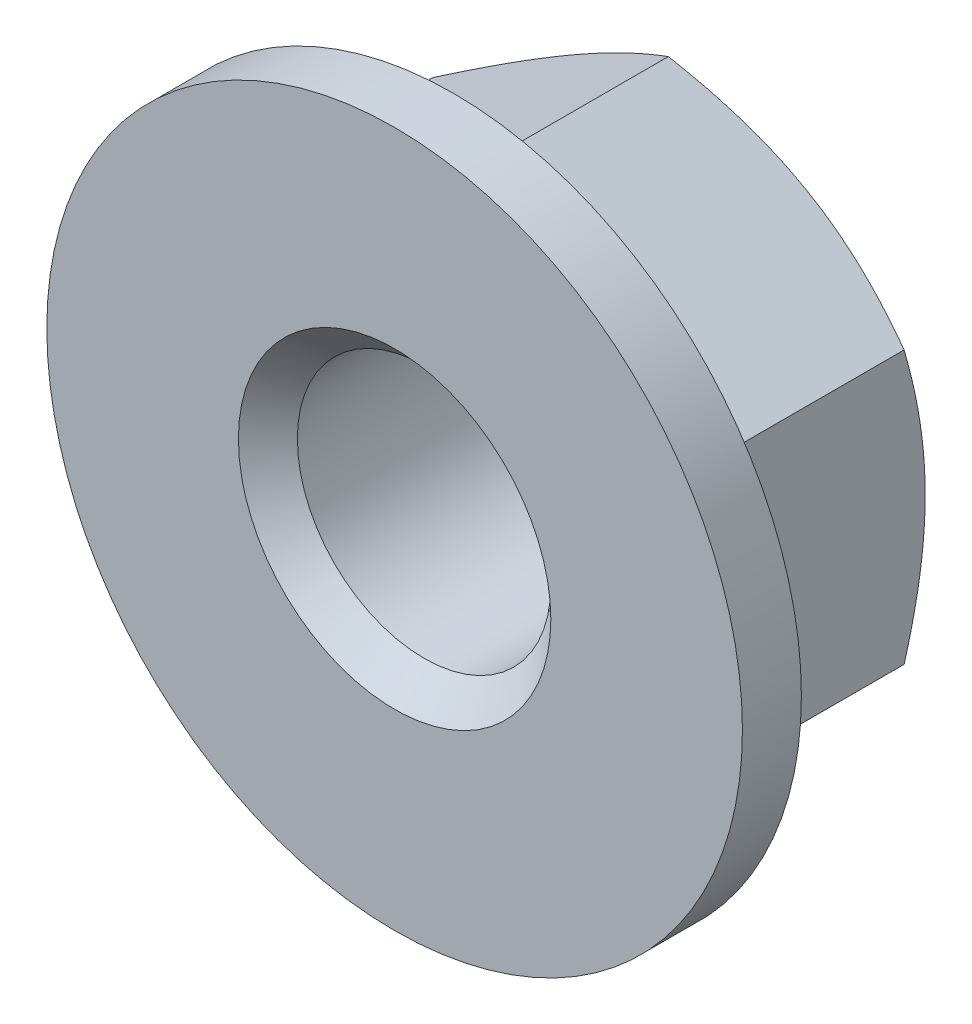
ISO-10303-21;
HEADER;
FILE_DESCRIPTION(('STEP AP214'),'2;1');
FILE_NAME('part.step','',(''),(''),'','','');
FILE_SCHEMA(('AUTOMOTIVE_DESIGN { 1 0 10303 214 1 1 1 1 }'));
ENDSEC;
DATA;
#1=APPLICATION_CONTEXT('core data for automotive mechanical design processes');
#2=APPLICATION_PROTOCOL_DEFINITION('international standard','automotive_design',2000,#1);
#3=PRODUCT_CONTEXT('',#1,'mechanical');
#4=PRODUCT('Part','Part','',(#3));
#5=PRODUCT_RELATED_PRODUCT_CATEGORY('part','',(#4));
#6=PRODUCT_DEFINITION_FORMATION('','',#4);
#7=PRODUCT_DEFINITION_CONTEXT('part definition',#1,'design');
#8=PRODUCT_DEFINITION('design','',#6,#7);
#9=PRODUCT_DEFINITION_SHAPE('','',#8);
#10=(LENGTH_UNIT() NAMED_UNIT(*) SI_UNIT(.MILLI.,.METRE.));
#11=(NAMED_UNIT(*) PLANE_ANGLE_UNIT() SI_UNIT($,.RADIAN.));
#12=(NAMED_UNIT(*) SI_UNIT($,.STERADIAN.) SOLID_ANGLE_UNIT());
#13=UNCERTAINTY_MEASURE_WITH_UNIT(LENGTH_MEASURE(1.E-05),#10,'distance_accuracy_value','');
#14=(GEOMETRIC_REPRESENTATION_CONTEXT(3) GLOBAL_UNCERTAINTY_ASSIGNED_CONTEXT((#13)) GLOBAL_UNIT_ASSIGNED_CONTEXT((#10,
#11,#12)) REPRESENTATION_CONTEXT('',''));
#15=CARTESIAN_POINT('',(0.,0.,0.));
#16=DIRECTION('',(0.,0.,1.));
#17=DIRECTION('',(1.,0.,0.));
#18=AXIS2_PLACEMENT_3D('',#15,#16,#17);
#19=CARTESIAN_POINT('',(4.,2.3094010767585,-4.));
#20=DIRECTION('',(0.5,0.866025403784439,0.));
#21=DIRECTION('',(-0.866025403784439,0.5,0.));
#22=AXIS2_PLACEMENT_3D('',#19,#20,#21);
#23=PLANE('',#22);
#24=DIRECTION('',(0.,0.,1.));
#25=VECTOR('',#24,1.);
#26=CARTESIAN_POINT('',(4.,2.3094010767585,-4.));
#27=LINE('',#26,#25);
#28=CARTESIAN_POINT('',(4.,2.3094010767585,-3.64273441009184));
#29=VERTEX_POINT('',#28);
#30=CARTESIAN_POINT('',(4.,2.3094010767585,-0.357265589908159));
#31=VERTEX_POINT('',#30);
#32=EDGE_CURVE('E366',#29,#31,#27,.T.);
#33=ORIENTED_EDGE('',*,*,#32,.F.);
#34=CARTESIAN_POINT('',(4.0002,2.30928560670467,-3.64266774092524));
#35=CARTESIAN_POINT('',(3.82442084967677,2.4107717464617,-3.70128212635172));
#36=CARTESIAN_POINT('',(3.64712438367362,2.51313390883499,-3.75458967853774));
#37=CARTESIAN_POINT('',(3.28946140682429,2.71963072479811,-3.8476383292536));
#38=CARTESIAN_POINT('',(3.10908854102985,2.82376904741904,-3.8873465109703));
#39=CARTESIAN_POINT('',(2.75057818129721,3.03075510011795,-3.94915778471972));
#40=CARTESIAN_POINT('',(2.57249584706486,3.13357098372492,-3.97167226847711));
#41=CARTESIAN_POINT('',(2.21549328283349,3.33968651028528,-3.99854937685342));
#42=CARTESIAN_POINT('',(2.0365743503559,3.44298540411434,-4.00293425857306));
#43=CARTESIAN_POINT('',(1.70225715780327,3.63600352522932,-3.99380992706003));
#44=CARTESIAN_POINT('',(1.54680884001294,3.72575165335064,-3.98254104601201));
#45=CARTESIAN_POINT('',(1.23692494436495,3.90466320392054,-3.94682600920181));
#46=CARTESIAN_POINT('',(1.08249043825587,3.99382600759478,-3.92236765428847));
#47=CARTESIAN_POINT('',(0.771967672225423,4.17310641015197,-3.86122393508071));
#48=CARTESIAN_POINT('',(0.615918711936899,4.26320131938131,-3.82427939634514));
#49=CARTESIAN_POINT('',(0.306148164596161,4.4420474282755,-3.74042992745198));
#50=CARTESIAN_POINT('',(0.152422609226221,4.53080091904966,-3.69354469778726));
#51=CARTESIAN_POINT('',(-0.00019999999999992,4.61891762357084,-3.64266774092524));
#52=B_SPLINE_CURVE_WITH_KNOTS('',3,(#34,#35,#36,#37,#38,#39,#40,#41,#42,#43,#44,#45,#46,#47,#48,
#49,#50,#51),.UNSPECIFIED.,.F.,.F.,(4,2,2,2,2,2,2,2,4),(0.,0.634047835695965,1.26961969224543,
1.88946157213122,2.50854226669297,3.04757825393385,3.58711366126903,4.13861653143763,
4.68903648037743),.UNSPECIFIED.);
#53=CARTESIAN_POINT('',(2.,3.46410161513775,-4.));
#54=VERTEX_POINT('',#53);
#55=EDGE_CURVE('E383',#29,#54,#52,.T.);
#56=ORIENTED_EDGE('',*,*,#55,.T.);
#57=CARTESIAN_POINT('',(0.,4.61880215351701,-3.64273441009184));
#58=VERTEX_POINT('',#57);
#59=EDGE_CURVE('E56',#54,#58,#52,.T.);
#60=ORIENTED_EDGE('',*,*,#59,.T.);
#61=DIRECTION('',(0.,0.,1.));
#62=VECTOR('',#61,1.);
#63=CARTESIAN_POINT('',(0.,4.61880215351701,-4.));
#64=LINE('',#63,#62);
#65=CARTESIAN_POINT('',(0.,4.61880215351701,-0.357265589908159));
#66=VERTEX_POINT('',#65);
#67=EDGE_CURVE('E137',#58,#66,#64,.T.);
#68=ORIENTED_EDGE('',*,*,#67,.T.);
#69=CARTESIAN_POINT('',(-0.000199999999999897,4.61891762357084,-0.357332259074763));
#70=CARTESIAN_POINT('',(0.175579150323228,4.5174314838138,-0.298717873648279));
#71=CARTESIAN_POINT('',(0.35287561632638,4.41506932144052,-0.245410321462259));
#72=CARTESIAN_POINT('',(0.710538593175706,4.20857250547739,-0.152361670746402));
#73=CARTESIAN_POINT('',(0.89091145897015,4.10443418285647,-0.112653489029703));
#74=CARTESIAN_POINT('',(1.24942181870279,3.89744813015756,-0.0508422152802784));
#75=CARTESIAN_POINT('',(1.42750415293514,3.79463224655059,-0.0283277315228884));
#76=CARTESIAN_POINT('',(1.78450671716651,3.58851671999023,-0.00145062314658126));
#77=CARTESIAN_POINT('',(1.9634256496441,3.48521782616117,0.00293425857305758));
#78=CARTESIAN_POINT('',(2.29774284219673,3.29219970504619,-0.00619007293996923));
#79=CARTESIAN_POINT('',(2.45319115998706,3.20245157692486,-0.0174589539879932));
#80=CARTESIAN_POINT('',(2.76307505563505,3.02354002635497,-0.0531739907981918));
#81=CARTESIAN_POINT('',(2.91750956174413,2.93437722268073,-0.0776323457115314));
#82=CARTESIAN_POINT('',(3.22803232777458,2.75509682012354,-0.138776064919287));
#83=CARTESIAN_POINT('',(3.3840812880631,2.6650019108942,-0.175720603654861));
#84=CARTESIAN_POINT('',(3.69385183540384,2.48615580200001,-0.259570072548024));
#85=CARTESIAN_POINT('',(3.84757739077378,2.39740231122585,-0.306455302212737));
#86=CARTESIAN_POINT('',(4.0002,2.30928560670467,-0.357332259074763));
#87=B_SPLINE_CURVE_WITH_KNOTS('',3,(#69,#70,#71,#72,#73,#74,#75,#76,#77,#78,#79,#80,#81,#82,#83,
#84,#85,#86),.UNSPECIFIED.,.F.,.F.,(4,2,2,2,2,2,2,2,4),(0.,0.634047835695965,1.26961969224543,
1.88946157213122,2.50854226669297,3.04757825393385,3.58711366126903,4.13861653143764,
4.68903648037743),.UNSPECIFIED.);
#88=CARTESIAN_POINT('',(2.,3.46410161513775,0.));
#89=VERTEX_POINT('',#88);
#90=EDGE_CURVE('E131',#66,#89,#87,.T.);
#91=ORIENTED_EDGE('',*,*,#90,.T.);
#92=EDGE_CURVE('E135',#89,#31,#87,.T.);
#93=ORIENTED_EDGE('',*,*,#92,.T.);
#94=EDGE_LOOP('',(#33,#56,#60,#68,#91,#93));
#95=FACE_BOUND('',#94,.T.);
#96=ADVANCED_FACE('F40',(#95),#23,.T.);
#97=CARTESIAN_POINT('',(4.,-2.3094010767585,-4.));
#98=DIRECTION('',(1.,0.,0.));
#99=DIRECTION('',(0.,0.,-1.));
#100=AXIS2_PLACEMENT_3D('',#97,#98,#99);
#101=PLANE('',#100);
#102=DIRECTION('',(0.,0.,1.));
#103=VECTOR('',#102,1.);
#104=CARTESIAN_POINT('',(4.,-2.3094010767585,-4.));
#105=LINE('',#104,#103);
#106=CARTESIAN_POINT('',(4.,-2.3094010767585,-3.64273441009184));
#107=VERTEX_POINT('',#106);
#108=CARTESIAN_POINT('',(4.,-2.3094010767585,-0.357265589908159));
#109=VERTEX_POINT('',#108);
#110=EDGE_CURVE('E377',#107,#109,#105,.T.);
#111=ORIENTED_EDGE('',*,*,#110,.F.);
#112=CARTESIAN_POINT('',(4.,-6.12487198995892,-2.08589317875939));
#113=CARTESIAN_POINT('',(4.,-5.94924937038676,-2.17076372923313));
#114=CARTESIAN_POINT('',(4.,-5.77321152095286,-2.25479059619263));
#115=CARTESIAN_POINT('',(4.,-5.42008084777954,-2.42067485320286));
#116=CARTESIAN_POINT('',(4.,-5.24298784779927,-2.50253186763279));
#117=CARTESIAN_POINT('',(4.,-4.88656571686333,-2.66402553694146));
#118=CARTESIAN_POINT('',(4.,-4.70722958889362,-2.74364680493698));
#119=CARTESIAN_POINT('',(4.,-4.34708334747263,-2.89946941457972));
#120=CARTESIAN_POINT('',(4.,-4.16627331143537,-2.975670934492));
#121=CARTESIAN_POINT('',(4.,-3.80064706744977,-3.12464934960565));
#122=CARTESIAN_POINT('',(4.,-3.6158089282277,-3.19737271578417));
#123=CARTESIAN_POINT('',(4.,-3.24395246794968,-3.33712376904059));
#124=CARTESIAN_POINT('',(4.,-3.05693390695801,-3.40415082243351));
#125=CARTESIAN_POINT('',(4.,-2.6808031825377,-3.53070825156913));
#126=CARTESIAN_POINT('',(4.,-2.49169643712848,-3.59025456521617));
#127=CARTESIAN_POINT('',(4.,-2.11079454635851,-3.6999166434555));
#128=CARTESIAN_POINT('',(4.,-1.91900027185748,-3.75003539032325));
#129=CARTESIAN_POINT('',(4.,-1.532592326982,-3.83840920504596));
#130=CARTESIAN_POINT('',(4.,-1.33797792031649,-3.87666111404346));
#131=CARTESIAN_POINT('',(4.,-0.946402725872552,-3.93872576407766));
#132=CARTESIAN_POINT('',(4.,-0.749441936019772,-3.9625384923483));
#133=CARTESIAN_POINT('',(4.,-0.355451989627941,-3.99361818685056));
#134=CARTESIAN_POINT('',(4.,-0.15843131109401,-4.00098990076104));
#135=CARTESIAN_POINT('',(4.,0.235472085607469,-3.9987959336252));
#136=CARTESIAN_POINT('',(4.,0.432354826312205,-3.98923464918465));
#137=CARTESIAN_POINT('',(4.,0.768560635225518,-3.95912126538641));
#138=CARTESIAN_POINT('',(4.,0.908254618381824,-3.94249070395609));
#139=CARTESIAN_POINT('',(4.,1.18656349063498,-3.90178658965331));
#140=CARTESIAN_POINT('',(4.,1.32517820601014,-3.87771186294155));
#141=CARTESIAN_POINT('',(4.,1.73929045452971,-3.79558492904977));
#142=CARTESIAN_POINT('',(4.,2.01284690528725,-3.72765111357484));
#143=CARTESIAN_POINT('',(4.,2.42218253014527,-3.61048364068279));
#144=CARTESIAN_POINT('',(4.,2.56009536361542,-3.56828605818836));
#145=CARTESIAN_POINT('',(4.,2.83448159101408,-3.47971541977223));
#146=CARTESIAN_POINT('',(4.,2.97095590623562,-3.43334524381308));
#147=CARTESIAN_POINT('',(4.,3.24189440516346,-3.3373943008197));
#148=CARTESIAN_POINT('',(4.,3.37636557946843,-3.28783307424649));
#149=CARTESIAN_POINT('',(4.,3.6442646115292,-3.18580164620929));
#150=CARTESIAN_POINT('',(4.,3.77769202239393,-3.13333026903662));
#151=CARTESIAN_POINT('',(4.,3.91063698986691,-3.0796909934582));
#152=B_SPLINE_CURVE_WITH_KNOTS('',3,(#112,#113,#114,#115,#116,#117,#118,#119,#120,#121,#122,
#123,#124,#125,#126,#127,#128,#129,#130,#131,#132,#133,#134,#135,#136,#137,#138,#139,#140,#141,
#142,#143,#144,#145,#146,#147,#148,#149,#150,#151),.UNSPECIFIED.,.F.,.F.,(4,2,2,2,2,2,2,2,2,2,2,
2,2,2,2,2,2,2,2,4),(0.,0.58517179253227,1.17044423059927,1.75906594645989,2.34765694284826,
2.94347400997483,3.53935727210688,4.13394864697599,4.7283516139147,5.32291267067844,
5.91747425310811,6.50823685854035,7.09884609659885,7.5206814082552,7.9425832713084,
8.78701491359831,9.21965281897692,9.65199437116301,10.0819024146297,10.5119854255247),.UNSPECIFIED.);
#153=CARTESIAN_POINT('',(4.,0.,-4.));
#154=VERTEX_POINT('',#153);
#155=EDGE_CURVE('E261',#107,#154,#152,.T.);
#156=ORIENTED_EDGE('',*,*,#155,.T.);
#157=EDGE_CURVE('E253',#154,#29,#152,.T.);
#158=ORIENTED_EDGE('',*,*,#157,.T.);
#159=ORIENTED_EDGE('',*,*,#32,.T.);
#160=CARTESIAN_POINT('',(4.,-6.12487198995892,-1.91410682124061));
#161=CARTESIAN_POINT('',(4.,-5.94924937038676,-1.82923627076687));
#162=CARTESIAN_POINT('',(4.,-5.77321152095286,-1.74520940380737));
#163=CARTESIAN_POINT('',(4.,-5.42008084777954,-1.57932514679714));
#164=CARTESIAN_POINT('',(4.,-5.24298784779927,-1.49746813236721));
#165=CARTESIAN_POINT('',(4.,-4.88656571686333,-1.33597446305854));
#166=CARTESIAN_POINT('',(4.,-4.70722958889362,-1.25635319506302));
#167=CARTESIAN_POINT('',(4.,-4.34708334747263,-1.10053058542028));
#168=CARTESIAN_POINT('',(4.,-4.16627331143537,-1.024329065508));
#169=CARTESIAN_POINT('',(4.,-3.80064706744977,-0.875350650394348));
#170=CARTESIAN_POINT('',(4.,-3.61580892822769,-0.802627284215832));
#171=CARTESIAN_POINT('',(4.,-3.24395246794968,-0.662876230959409));
#172=CARTESIAN_POINT('',(4.,-3.05693390695801,-0.595849177566494));
#173=CARTESIAN_POINT('',(4.,-2.6808031825377,-0.469291748430873));
#174=CARTESIAN_POINT('',(4.,-2.49169643712848,-0.40974543478383));
#175=CARTESIAN_POINT('',(4.,-2.11079454635851,-0.300083356544501));
#176=CARTESIAN_POINT('',(4.,-1.91900027185748,-0.249964609676747));
#177=CARTESIAN_POINT('',(4.,-1.532592326982,-0.161590794954039));
#178=CARTESIAN_POINT('',(4.,-1.33797792031649,-0.123338885956537));
#179=CARTESIAN_POINT('',(4.,-0.946402725872551,-0.0612742359223417));
#180=CARTESIAN_POINT('',(4.,-0.749441936019772,-0.0374615076516979));
#181=CARTESIAN_POINT('',(4.,-0.355451989627941,-0.00638181314943615));
#182=CARTESIAN_POINT('',(4.,-0.15843131109401,0.000989900761041345));
#183=CARTESIAN_POINT('',(4.,0.235472085607468,-0.00120406637479567));
#184=CARTESIAN_POINT('',(4.,0.432354826312204,-0.0107653508153507));
#185=CARTESIAN_POINT('',(4.,0.768560635225518,-0.0408787346135903));
#186=CARTESIAN_POINT('',(4.,0.908254618381823,-0.0575092960439094));
#187=CARTESIAN_POINT('',(4.,1.18656349063498,-0.0982134103466919));
#188=CARTESIAN_POINT('',(4.,1.32517820601014,-0.122288137058447));
#189=CARTESIAN_POINT('',(4.,1.73929045452971,-0.204415070950233));
#190=CARTESIAN_POINT('',(4.,2.01284690528725,-0.272348886425156));
#191=CARTESIAN_POINT('',(4.,2.42218253014527,-0.389516359317208));
#192=CARTESIAN_POINT('',(4.,2.56009536361542,-0.431713941811641));
#193=CARTESIAN_POINT('',(4.,2.83448159101408,-0.520284580227768));
#194=CARTESIAN_POINT('',(4.,2.97095590623562,-0.566654756186919));
#195=CARTESIAN_POINT('',(4.,3.24189440516345,-0.662605699180295));
#196=CARTESIAN_POINT('',(4.,3.37636557946843,-0.712166925753509));
#197=CARTESIAN_POINT('',(4.,3.6442646115292,-0.814198353790713));
#198=CARTESIAN_POINT('',(4.,3.77769202239393,-0.866669730963381));
#199=CARTESIAN_POINT('',(4.,3.9106369898669,-0.920309006541805));
#200=B_SPLINE_CURVE_WITH_KNOTS('',3,(#160,#161,#162,#163,#164,#165,#166,#167,#168,#169,#170,
#171,#172,#173,#174,#175,#176,#177,#178,#179,#180,#181,#182,#183,#184,#185,#186,#187,#188,#189,
#190,#191,#192,#193,#194,#195,#196,#197,#198,#199),.UNSPECIFIED.,.F.,.F.,(4,2,2,2,2,2,2,2,2,2,2,
2,2,2,2,2,2,2,2,4),(0.,0.585171792532269,1.17044423059926,1.75906594645989,2.34765694284826,
2.94347400997483,3.53935727210688,4.13394864697599,4.7283516139147,5.32291267067844,
5.91747425310811,6.50823685854035,7.09884609659885,7.5206814082552,7.9425832713084,
8.78701491359831,9.21965281897691,9.651994371163,10.0819024146297,10.5119854255247),.UNSPECIFIED.);
#201=CARTESIAN_POINT('',(4.,0.,0.));
#202=VERTEX_POINT('',#201);
#203=EDGE_CURVE('E161',#31,#202,#200,.F.);
#204=ORIENTED_EDGE('',*,*,#203,.T.);
#205=EDGE_CURVE('E233',#202,#109,#200,.F.);
#206=ORIENTED_EDGE('',*,*,#205,.T.);
#207=EDGE_LOOP('',(#111,#156,#158,#159,#204,#206));
#208=FACE_BOUND('',#207,.T.);
#209=ADVANCED_FACE('F246',(#208),#101,.T.);
#210=CARTESIAN_POINT('',(0.,-4.61880215351701,-4.));
#211=DIRECTION('',(0.5,-0.866025403784439,0.));
#212=DIRECTION('',(0.866025403784439,0.5,0.));
#213=AXIS2_PLACEMENT_3D('',#210,#211,#212);
#214=PLANE('',#213);
#215=DIRECTION('',(0.,0.,1.));
#216=VECTOR('',#215,1.);
#217=CARTESIAN_POINT('',(0.,-4.61880215351701,-4.));
#218=LINE('',#217,#216);
#219=CARTESIAN_POINT('',(0.,-4.61880215351701,-3.64273441009184));
#220=VERTEX_POINT('',#219);
#221=CARTESIAN_POINT('',(0.,-4.61880215351701,-0.357265589908159));
#222=VERTEX_POINT('',#221);
#223=EDGE_CURVE('E374',#220,#222,#218,.T.);
#224=ORIENTED_EDGE('',*,*,#223,.F.);
#225=CARTESIAN_POINT('',(-0.00020000000000105,-4.61891762357084,-3.64266774092524));
#226=CARTESIAN_POINT('',(0.175579150323227,-4.5174314838138,-3.70128212635172));
#227=CARTESIAN_POINT('',(0.352875616326379,-4.41506932144052,-3.75458967853774));
#228=CARTESIAN_POINT('',(0.710538593175705,-4.20857250547739,-3.8476383292536));
#229=CARTESIAN_POINT('',(0.890911458970149,-4.10443418285647,-3.8873465109703));
#230=CARTESIAN_POINT('',(1.24942181870279,-3.89744813015756,-3.94915778471972));
#231=CARTESIAN_POINT('',(1.42750415293514,-3.79463224655059,-3.97167226847711));
#232=CARTESIAN_POINT('',(1.78450671716651,-3.58851671999023,-3.99854937685342));
#233=CARTESIAN_POINT('',(1.9634256496441,-3.48521782616117,-4.00293425857306));
#234=CARTESIAN_POINT('',(2.29774284219673,-3.29219970504619,-3.99380992706003));
#235=CARTESIAN_POINT('',(2.45319115998706,-3.20245157692486,-3.98254104601201));
#236=CARTESIAN_POINT('',(2.76307505563505,-3.02354002635497,-3.94682600920181));
#237=CARTESIAN_POINT('',(2.91750956174413,-2.93437722268073,-3.92236765428847));
#238=CARTESIAN_POINT('',(3.22803232777458,-2.75509682012354,-3.86122393508071));
#239=CARTESIAN_POINT('',(3.3840812880631,-2.6650019108942,-3.82427939634514));
#240=CARTESIAN_POINT('',(3.69385183540384,-2.48615580200001,-3.74042992745198));
#241=CARTESIAN_POINT('',(3.84757739077378,-2.39740231122585,-3.69354469778726));
#242=CARTESIAN_POINT('',(4.0002,-2.30928560670467,-3.64266774092524));
#243=B_SPLINE_CURVE_WITH_KNOTS('',3,(#225,#226,#227,#228,#229,#230,#231,#232,#233,#234,#235,
#236,#237,#238,#239,#240,#241,#242),.UNSPECIFIED.,.F.,.F.,(4,2,2,2,2,2,2,2,4),(0.,
0.634047835695965,1.26961969224543,1.88946157213122,2.50854226669297,3.04757825393385,
3.58711366126903,4.13861653143764,4.68903648037743),.UNSPECIFIED.);
#244=CARTESIAN_POINT('',(2.,-3.46410161513776,-4.));
#245=VERTEX_POINT('',#244);
#246=EDGE_CURVE('E169',#220,#245,#243,.T.);
#247=ORIENTED_EDGE('',*,*,#246,.T.);
#248=EDGE_CURVE('E178',#245,#107,#243,.T.);
#249=ORIENTED_EDGE('',*,*,#248,.T.);
#250=ORIENTED_EDGE('',*,*,#110,.T.);
#251=CARTESIAN_POINT('',(4.0002,-2.30928560670467,-0.357332259074763));
#252=CARTESIAN_POINT('',(3.82442084967677,-2.4107717464617,-0.29871787364828));
#253=CARTESIAN_POINT('',(3.64712438367362,-2.51313390883499,-0.24541032146226));
#254=CARTESIAN_POINT('',(3.28946140682429,-2.71963072479811,-0.152361670746402));
#255=CARTESIAN_POINT('',(3.10908854102985,-2.82376904741904,-0.112653489029703));
#256=CARTESIAN_POINT('',(2.75057818129721,-3.03075510011795,-0.0508422152802779));
#257=CARTESIAN_POINT('',(2.57249584706486,-3.13357098372492,-0.0283277315228877));
#258=CARTESIAN_POINT('',(2.21549328283349,-3.33968651028528,-0.00145062314658116));
#259=CARTESIAN_POINT('',(2.0365743503559,-3.44298540411434,0.00293425857305695));
#260=CARTESIAN_POINT('',(1.70225715780327,-3.63600352522932,-0.00619007293996975));
#261=CARTESIAN_POINT('',(1.54680884001294,-3.72575165335064,-0.0174589539879931));
#262=CARTESIAN_POINT('',(1.23692494436495,-3.90466320392054,-0.0531739907981916));
#263=CARTESIAN_POINT('',(1.08249043825587,-3.99382600759478,-0.0776323457115316));
#264=CARTESIAN_POINT('',(0.771967672225422,-4.17310641015197,-0.138776064919288));
#265=CARTESIAN_POINT('',(0.615918711936898,-4.26320131938131,-0.175720603654861));
#266=CARTESIAN_POINT('',(0.30614816459616,-4.4420474282755,-0.259570072548024));
#267=CARTESIAN_POINT('',(0.15242260922622,-4.53080091904966,-0.306455302212736));
#268=CARTESIAN_POINT('',(-0.000200000000001096,-4.61891762357084,-0.357332259074763));
#269=B_SPLINE_CURVE_WITH_KNOTS('',3,(#251,#252,#253,#254,#255,#256,#257,#258,#259,#260,#261,
#262,#263,#264,#265,#266,#267,#268),.UNSPECIFIED.,.F.,.F.,(4,2,2,2,2,2,2,2,4),(0.,
0.634047835695965,1.26961969224543,1.88946157213122,2.50854226669297,3.04757825393385,
3.58711366126903,4.13861653143764,4.68903648037743),.UNSPECIFIED.);
#270=CARTESIAN_POINT('',(2.,-3.46410161513776,0.));
#271=VERTEX_POINT('',#270);
#272=EDGE_CURVE('E240',#109,#271,#269,.T.);
#273=ORIENTED_EDGE('',*,*,#272,.T.);
#274=EDGE_CURVE('E227',#271,#222,#269,.T.);
#275=ORIENTED_EDGE('',*,*,#274,.T.);
#276=EDGE_LOOP('',(#224,#247,#249,#250,#273,#275));
#277=FACE_BOUND('',#276,.T.);
#278=ADVANCED_FACE('F249',(#277),#214,.T.);
#279=CARTESIAN_POINT('',(-4.,-2.3094010767585,-4.));
#280=DIRECTION('',(-0.5,-0.866025403784439,0.));
#281=DIRECTION('',(0.866025403784438,-0.5,0.));
#282=AXIS2_PLACEMENT_3D('',#279,#280,#281);
#283=PLANE('',#282);
#284=DIRECTION('',(0.,0.,1.));
#285=VECTOR('',#284,1.);
#286=CARTESIAN_POINT('',(-4.,-2.3094010767585,-4.));
#287=LINE('',#286,#285);
#288=CARTESIAN_POINT('',(-4.,-2.3094010767585,-3.64273441009184));
#289=VERTEX_POINT('',#288);
#290=CARTESIAN_POINT('',(-4.,-2.3094010767585,-0.357265589908159));
#291=VERTEX_POINT('',#290);
#292=EDGE_CURVE('E371',#289,#291,#287,.T.);
#293=ORIENTED_EDGE('',*,*,#292,.F.);
#294=CARTESIAN_POINT('',(-4.0002,-2.30928560670467,-3.64266774092524));
#295=CARTESIAN_POINT('',(-3.82442084967677,-2.4107717464617,-3.70128212635172));
#296=CARTESIAN_POINT('',(-3.64712438367362,-2.51313390883499,-3.75458967853774));
#297=CARTESIAN_POINT('',(-3.28946140682429,-2.71963072479811,-3.8476383292536));
#298=CARTESIAN_POINT('',(-3.10908854102985,-2.82376904741904,-3.8873465109703));
#299=CARTESIAN_POINT('',(-2.75057818129721,-3.03075510011795,-3.94915778471972));
#300=CARTESIAN_POINT('',(-2.57249584706486,-3.13357098372492,-3.97167226847711));
#301=CARTESIAN_POINT('',(-2.21549328283349,-3.33968651028528,-3.99854937685342));
#302=CARTESIAN_POINT('',(-2.0365743503559,-3.44298540411434,-4.00293425857306));
#303=CARTESIAN_POINT('',(-1.70225715780327,-3.63600352522932,-3.99380992706003));
#304=CARTESIAN_POINT('',(-1.54680884001294,-3.72575165335065,-3.98254104601201));
#305=CARTESIAN_POINT('',(-1.23692494436495,-3.90466320392054,-3.94682600920181));
#306=CARTESIAN_POINT('',(-1.08249043825587,-3.99382600759478,-3.92236765428847));
#307=CARTESIAN_POINT('',(-0.771967672225424,-4.17310641015197,-3.86122393508071));
#308=CARTESIAN_POINT('',(-0.6159187119369,-4.26320131938131,-3.82427939634514));
#309=CARTESIAN_POINT('',(-0.306148164596162,-4.4420474282755,-3.74042992745198));
#310=CARTESIAN_POINT('',(-0.152422609226222,-4.53080091904966,-3.69354469778726));
#311=CARTESIAN_POINT('',(0.000199999999998778,-4.61891762357084,-3.64266774092524));
#312=B_SPLINE_CURVE_WITH_KNOTS('',3,(#294,#295,#296,#297,#298,#299,#300,#301,#302,#303,#304,
#305,#306,#307,#308,#309,#310,#311),.UNSPECIFIED.,.F.,.F.,(4,2,2,2,2,2,2,2,4),(0.,
0.634047835695965,1.26961969224543,1.88946157213122,2.50854226669297,3.04757825393385,
3.58711366126903,4.13861653143763,4.68903648037743),.UNSPECIFIED.);
#313=CARTESIAN_POINT('',(-2.,-3.46410161513775,-4.));
#314=VERTEX_POINT('',#313);
#315=EDGE_CURVE('E262',#289,#314,#312,.T.);
#316=ORIENTED_EDGE('',*,*,#315,.T.);
#317=EDGE_CURVE('E271',#314,#220,#312,.T.);
#318=ORIENTED_EDGE('',*,*,#317,.T.);
#319=ORIENTED_EDGE('',*,*,#223,.T.);
#320=CARTESIAN_POINT('',(0.000199999999999024,-4.61891762357084,-0.357332259074763));
#321=CARTESIAN_POINT('',(-0.175579150323229,-4.5174314838138,-0.29871787364828));
#322=CARTESIAN_POINT('',(-0.352875616326382,-4.41506932144052,-0.24541032146226));
#323=CARTESIAN_POINT('',(-0.710538593175707,-4.2085725054774,-0.152361670746402));
#324=CARTESIAN_POINT('',(-0.890911458970151,-4.10443418285647,-0.112653489029703));
#325=CARTESIAN_POINT('',(-1.24942181870279,-3.89744813015756,-0.0508422152802784));
#326=CARTESIAN_POINT('',(-1.42750415293514,-3.79463224655059,-0.0283277315228884));
#327=CARTESIAN_POINT('',(-1.78450671716651,-3.58851671999023,-0.00145062314658152));
#328=CARTESIAN_POINT('',(-1.9634256496441,-3.48521782616117,0.00293425857305707));
#329=CARTESIAN_POINT('',(-2.29774284219673,-3.29219970504619,-0.00619007293996974));
#330=CARTESIAN_POINT('',(-2.45319115998707,-3.20245157692486,-0.0174589539879935));
#331=CARTESIAN_POINT('',(-2.76307505563505,-3.02354002635497,-0.0531739907981922));
#332=CARTESIAN_POINT('',(-2.91750956174413,-2.93437722268073,-0.0776323457115319));
#333=CARTESIAN_POINT('',(-3.22803232777458,-2.75509682012354,-0.138776064919288));
#334=CARTESIAN_POINT('',(-3.3840812880631,-2.6650019108942,-0.175720603654861));
#335=CARTESIAN_POINT('',(-3.69385183540384,-2.48615580200001,-0.259570072548024));
#336=CARTESIAN_POINT('',(-3.84757739077378,-2.39740231122585,-0.306455302212736));
#337=CARTESIAN_POINT('',(-4.0002,-2.30928560670467,-0.357332259074763));
#338=B_SPLINE_CURVE_WITH_KNOTS('',3,(#320,#321,#322,#323,#324,#325,#326,#327,#328,#329,#330,
#331,#332,#333,#334,#335,#336,#337),.UNSPECIFIED.,.F.,.F.,(4,2,2,2,2,2,2,2,4),(0.,
0.634047835695965,1.26961969224543,1.88946157213122,2.50854226669297,3.04757825393386,
3.58711366126903,4.13861653143764,4.68903648037743),.UNSPECIFIED.);
#339=CARTESIAN_POINT('',(-2.,-3.46410161513775,0.));
#340=VERTEX_POINT('',#339);
#341=EDGE_CURVE('E404',#222,#340,#338,.T.);
#342=ORIENTED_EDGE('',*,*,#341,.T.);
#343=EDGE_CURVE('E220',#340,#291,#338,.T.);
#344=ORIENTED_EDGE('',*,*,#343,.T.);
#345=EDGE_LOOP('',(#293,#316,#318,#319,#342,#344));
#346=FACE_BOUND('',#345,.T.);
#347=ADVANCED_FACE('F277',(#346),#283,.T.);
#348=CARTESIAN_POINT('',(-4.,2.3094010767585,-4.));
#349=DIRECTION('',(-1.,0.,0.));
#350=DIRECTION('',(0.,0.,1.));
#351=AXIS2_PLACEMENT_3D('',#348,#349,#350);
#352=PLANE('',#351);
#353=DIRECTION('',(0.,0.,1.));
#354=VECTOR('',#353,1.);
#355=CARTESIAN_POINT('',(-4.,2.3094010767585,-4.));
#356=LINE('',#355,#354);
#357=CARTESIAN_POINT('',(-4.,2.3094010767585,-3.64273441009184));
#358=VERTEX_POINT('',#357);
#359=CARTESIAN_POINT('',(-4.,2.3094010767585,-0.357265589908159));
#360=VERTEX_POINT('',#359);
#361=EDGE_CURVE('E368',#358,#360,#356,.T.);
#362=ORIENTED_EDGE('',*,*,#361,.F.);
#363=CARTESIAN_POINT('',(-4.,-6.12487198995892,-2.08589317875939));
#364=CARTESIAN_POINT('',(-4.,-5.94924937038676,-2.17076372923313));
#365=CARTESIAN_POINT('',(-4.,-5.77321152095286,-2.25479059619263));
#366=CARTESIAN_POINT('',(-4.,-5.42008084777954,-2.42067485320286));
#367=CARTESIAN_POINT('',(-4.,-5.24298784779927,-2.50253186763279));
#368=CARTESIAN_POINT('',(-4.,-4.88656571686333,-2.66402553694146));
#369=CARTESIAN_POINT('',(-4.,-4.70722958889362,-2.74364680493698));
#370=CARTESIAN_POINT('',(-4.,-4.34708334747263,-2.89946941457972));
#371=CARTESIAN_POINT('',(-4.,-4.16627331143537,-2.975670934492));
#372=CARTESIAN_POINT('',(-4.,-3.80064706744977,-3.12464934960565));
#373=CARTESIAN_POINT('',(-4.,-3.6158089282277,-3.19737271578417));
#374=CARTESIAN_POINT('',(-4.,-3.24395246794968,-3.33712376904059));
#375=CARTESIAN_POINT('',(-4.,-3.05693390695801,-3.40415082243351));
#376=CARTESIAN_POINT('',(-4.,-2.6808031825377,-3.53070825156913));
#377=CARTESIAN_POINT('',(-4.,-2.49169643712848,-3.59025456521617));
#378=CARTESIAN_POINT('',(-4.,-2.11079454635851,-3.6999166434555));
#379=CARTESIAN_POINT('',(-4.,-1.91900027185748,-3.75003539032325));
#380=CARTESIAN_POINT('',(-4.,-1.532592326982,-3.83840920504596));
#381=CARTESIAN_POINT('',(-4.,-1.33797792031649,-3.87666111404346));
#382=CARTESIAN_POINT('',(-4.,-0.946402725872552,-3.93872576407766));
#383=CARTESIAN_POINT('',(-4.,-0.749441936019772,-3.9625384923483));
#384=CARTESIAN_POINT('',(-4.,-0.355451989627941,-3.99361818685056));
#385=CARTESIAN_POINT('',(-4.,-0.15843131109401,-4.00098990076104));
#386=CARTESIAN_POINT('',(-4.,0.235472085607469,-3.9987959336252));
#387=CARTESIAN_POINT('',(-4.,0.432354826312205,-3.98923464918465));
#388=CARTESIAN_POINT('',(-4.,0.768560635225518,-3.95912126538641));
#389=CARTESIAN_POINT('',(-4.,0.908254618381824,-3.94249070395609));
#390=CARTESIAN_POINT('',(-4.,1.18656349063498,-3.90178658965331));
#391=CARTESIAN_POINT('',(-4.,1.32517820601014,-3.87771186294155));
#392=CARTESIAN_POINT('',(-4.,1.73929045452971,-3.79558492904977));
#393=CARTESIAN_POINT('',(-4.,2.01284690528725,-3.72765111357484));
#394=CARTESIAN_POINT('',(-4.,2.42218253014527,-3.61048364068279));
#395=CARTESIAN_POINT('',(-4.,2.56009536361542,-3.56828605818836));
#396=CARTESIAN_POINT('',(-4.,2.83448159101408,-3.47971541977223));
#397=CARTESIAN_POINT('',(-4.,2.97095590623562,-3.43334524381308));
#398=CARTESIAN_POINT('',(-4.,3.24189440516346,-3.3373943008197));
#399=CARTESIAN_POINT('',(-4.,3.37636557946843,-3.28783307424649));
#400=CARTESIAN_POINT('',(-4.,3.6442646115292,-3.18580164620929));
#401=CARTESIAN_POINT('',(-4.,3.77769202239393,-3.13333026903662));
#402=CARTESIAN_POINT('',(-4.,3.91063698986691,-3.0796909934582));
#403=B_SPLINE_CURVE_WITH_KNOTS('',3,(#363,#364,#365,#366,#367,#368,#369,#370,#371,#372,#373,
#374,#375,#376,#377,#378,#379,#380,#381,#382,#383,#384,#385,#386,#387,#388,#389,#390,#391,#392,
#393,#394,#395,#396,#397,#398,#399,#400,#401,#402),.UNSPECIFIED.,.F.,.F.,(4,2,2,2,2,2,2,2,2,2,2,
2,2,2,2,2,2,2,2,4),(0.,0.58517179253227,1.17044423059927,1.75906594645989,2.34765694284826,
2.94347400997483,3.53935727210688,4.13394864697599,4.7283516139147,5.32291267067844,
5.91747425310811,6.50823685854035,7.09884609659885,7.5206814082552,7.9425832713084,
8.78701491359831,9.21965281897692,9.65199437116301,10.0819024146297,10.5119854255247),.UNSPECIFIED.);
#404=CARTESIAN_POINT('',(-4.,0.,-4.));
#405=VERTEX_POINT('',#404);
#406=EDGE_CURVE('E287',#358,#405,#403,.F.);
#407=ORIENTED_EDGE('',*,*,#406,.T.);
#408=EDGE_CURVE('E270',#405,#289,#403,.F.);
#409=ORIENTED_EDGE('',*,*,#408,.T.);
#410=ORIENTED_EDGE('',*,*,#292,.T.);
#411=CARTESIAN_POINT('',(-4.,-6.12487198995892,-1.91410682124061));
#412=CARTESIAN_POINT('',(-4.,-5.94924937038676,-1.82923627076687));
#413=CARTESIAN_POINT('',(-4.,-5.77321152095286,-1.74520940380737));
#414=CARTESIAN_POINT('',(-4.,-5.42008084777954,-1.57932514679714));
#415=CARTESIAN_POINT('',(-4.,-5.24298784779927,-1.49746813236721));
#416=CARTESIAN_POINT('',(-4.,-4.88656571686333,-1.33597446305854));
#417=CARTESIAN_POINT('',(-4.,-4.70722958889362,-1.25635319506302));
#418=CARTESIAN_POINT('',(-4.,-4.34708334747263,-1.10053058542028));
#419=CARTESIAN_POINT('',(-4.,-4.16627331143537,-1.024329065508));
#420=CARTESIAN_POINT('',(-4.,-3.80064706744977,-0.875350650394348));
#421=CARTESIAN_POINT('',(-4.,-3.61580892822769,-0.802627284215832));
#422=CARTESIAN_POINT('',(-4.,-3.24395246794968,-0.662876230959409));
#423=CARTESIAN_POINT('',(-4.,-3.05693390695801,-0.595849177566494));
#424=CARTESIAN_POINT('',(-4.,-2.6808031825377,-0.469291748430873));
#425=CARTESIAN_POINT('',(-4.,-2.49169643712848,-0.40974543478383));
#426=CARTESIAN_POINT('',(-4.,-2.11079454635851,-0.300083356544501));
#427=CARTESIAN_POINT('',(-4.,-1.91900027185748,-0.249964609676747));
#428=CARTESIAN_POINT('',(-4.,-1.532592326982,-0.161590794954039));
#429=CARTESIAN_POINT('',(-4.,-1.33797792031649,-0.123338885956537));
#430=CARTESIAN_POINT('',(-4.,-0.946402725872551,-0.0612742359223417));
#431=CARTESIAN_POINT('',(-4.,-0.749441936019772,-0.0374615076516979));
#432=CARTESIAN_POINT('',(-4.,-0.355451989627941,-0.00638181314943615));
#433=CARTESIAN_POINT('',(-4.,-0.15843131109401,0.000989900761041345));
#434=CARTESIAN_POINT('',(-4.,0.235472085607468,-0.00120406637479567));
#435=CARTESIAN_POINT('',(-4.,0.432354826312204,-0.0107653508153507));
#436=CARTESIAN_POINT('',(-4.,0.768560635225518,-0.0408787346135903));
#437=CARTESIAN_POINT('',(-4.,0.908254618381823,-0.0575092960439094));
#438=CARTESIAN_POINT('',(-4.,1.18656349063498,-0.0982134103466919));
#439=CARTESIAN_POINT('',(-4.,1.32517820601014,-0.122288137058447));
#440=CARTESIAN_POINT('',(-4.,1.73929045452971,-0.204415070950233));
#441=CARTESIAN_POINT('',(-4.,2.01284690528725,-0.272348886425156));
#442=CARTESIAN_POINT('',(-4.,2.42218253014527,-0.389516359317208));
#443=CARTESIAN_POINT('',(-4.,2.56009536361542,-0.431713941811641));
#444=CARTESIAN_POINT('',(-4.,2.83448159101408,-0.520284580227768));
#445=CARTESIAN_POINT('',(-4.,2.97095590623562,-0.566654756186919));
#446=CARTESIAN_POINT('',(-4.,3.24189440516345,-0.662605699180295));
#447=CARTESIAN_POINT('',(-4.,3.37636557946843,-0.712166925753509));
#448=CARTESIAN_POINT('',(-4.,3.6442646115292,-0.814198353790713));
#449=CARTESIAN_POINT('',(-4.,3.77769202239393,-0.866669730963381));
#450=CARTESIAN_POINT('',(-4.,3.9106369898669,-0.920309006541805));
#451=B_SPLINE_CURVE_WITH_KNOTS('',3,(#411,#412,#413,#414,#415,#416,#417,#418,#419,#420,#421,
#422,#423,#424,#425,#426,#427,#428,#429,#430,#431,#432,#433,#434,#435,#436,#437,#438,#439,#440,
#441,#442,#443,#444,#445,#446,#447,#448,#449,#450),.UNSPECIFIED.,.F.,.F.,(4,2,2,2,2,2,2,2,2,2,2,
2,2,2,2,2,2,2,2,4),(0.,0.585171792532269,1.17044423059926,1.75906594645989,2.34765694284826,
2.94347400997483,3.53935727210688,4.13394864697599,4.7283516139147,5.32291267067844,
5.91747425310811,6.50823685854035,7.09884609659885,7.5206814082552,7.9425832713084,
8.78701491359831,9.21965281897691,9.651994371163,10.0819024146297,10.5119854255247),.UNSPECIFIED.);
#452=CARTESIAN_POINT('',(-4.,0.,0.));
#453=VERTEX_POINT('',#452);
#454=EDGE_CURVE('E395',#291,#453,#451,.T.);
#455=ORIENTED_EDGE('',*,*,#454,.T.);
#456=EDGE_CURVE('E194',#453,#360,#451,.T.);
#457=ORIENTED_EDGE('',*,*,#456,.T.);
#458=EDGE_LOOP('',(#362,#407,#409,#410,#455,#457));
#459=FACE_BOUND('',#458,.T.);
#460=ADVANCED_FACE('F280',(#459),#352,.T.);
#461=CARTESIAN_POINT('',(0.,4.61880215351701,-4.));
#462=DIRECTION('',(-0.5,0.866025403784439,0.));
#463=DIRECTION('',(-0.866025403784439,-0.5,0.));
#464=AXIS2_PLACEMENT_3D('',#461,#462,#463);
#465=PLANE('',#464);
#466=ORIENTED_EDGE('',*,*,#67,.F.);
#467=CARTESIAN_POINT('',(0.000200000000000193,4.61891762357084,-3.64266774092524));
#468=CARTESIAN_POINT('',(-0.175579150323227,4.5174314838138,-3.70128212635172));
#469=CARTESIAN_POINT('',(-0.35287561632638,4.41506932144052,-3.75458967853774));
#470=CARTESIAN_POINT('',(-0.710538593175705,4.20857250547739,-3.8476383292536));
#471=CARTESIAN_POINT('',(-0.89091145897015,4.10443418285647,-3.8873465109703));
#472=CARTESIAN_POINT('',(-1.24942181870279,3.89744813015756,-3.94915778471972));
#473=CARTESIAN_POINT('',(-1.42750415293514,3.79463224655059,-3.97167226847711));
#474=CARTESIAN_POINT('',(-1.78450671716651,3.58851671999023,-3.99854937685342));
#475=CARTESIAN_POINT('',(-1.9634256496441,3.48521782616117,-4.00293425857306));
#476=CARTESIAN_POINT('',(-2.29774284219673,3.29219970504619,-3.99380992706003));
#477=CARTESIAN_POINT('',(-2.45319115998706,3.20245157692486,-3.98254104601201));
#478=CARTESIAN_POINT('',(-2.76307505563505,3.02354002635497,-3.94682600920181));
#479=CARTESIAN_POINT('',(-2.91750956174413,2.93437722268073,-3.92236765428847));
#480=CARTESIAN_POINT('',(-3.22803232777458,2.75509682012354,-3.86122393508071));
#481=CARTESIAN_POINT('',(-3.3840812880631,2.6650019108942,-3.82427939634514));
#482=CARTESIAN_POINT('',(-3.69385183540384,2.48615580200001,-3.74042992745198));
#483=CARTESIAN_POINT('',(-3.84757739077378,2.39740231122585,-3.69354469778726));
#484=CARTESIAN_POINT('',(-4.0002,2.30928560670467,-3.64266774092524));
#485=B_SPLINE_CURVE_WITH_KNOTS('',3,(#467,#468,#469,#470,#471,#472,#473,#474,#475,#476,#477,
#478,#479,#480,#481,#482,#483,#484),.UNSPECIFIED.,.F.,.F.,(4,2,2,2,2,2,2,2,4),(0.,
0.634047835695965,1.26961969224543,1.88946157213122,2.50854226669297,3.04757825393385,
3.58711366126903,4.13861653143763,4.68903648037743),.UNSPECIFIED.);
#486=CARTESIAN_POINT('',(-2.,3.46410161513775,-4.));
#487=VERTEX_POINT('',#486);
#488=EDGE_CURVE('E295',#58,#487,#485,.T.);
#489=ORIENTED_EDGE('',*,*,#488,.T.);
#490=EDGE_CURVE('E64',#487,#358,#485,.T.);
#491=ORIENTED_EDGE('',*,*,#490,.T.);
#492=ORIENTED_EDGE('',*,*,#361,.T.);
#493=CARTESIAN_POINT('',(-4.0002,2.30928560670467,-0.357332259074763));
#494=CARTESIAN_POINT('',(-3.82442084967677,2.4107717464617,-0.29871787364828));
#495=CARTESIAN_POINT('',(-3.64712438367362,2.51313390883499,-0.24541032146226));
#496=CARTESIAN_POINT('',(-3.28946140682429,2.71963072479811,-0.152361670746402));
#497=CARTESIAN_POINT('',(-3.10908854102985,2.82376904741904,-0.112653489029703));
#498=CARTESIAN_POINT('',(-2.75057818129721,3.03075510011795,-0.050842215280278));
#499=CARTESIAN_POINT('',(-2.57249584706486,3.13357098372492,-0.0283277315228878));
#500=CARTESIAN_POINT('',(-2.21549328283349,3.33968651028528,-0.00145062314658113));
#501=CARTESIAN_POINT('',(-2.0365743503559,3.44298540411434,0.00293425857305706));
#502=CARTESIAN_POINT('',(-1.70225715780327,3.63600352522932,-0.00619007293996961));
#503=CARTESIAN_POINT('',(-1.54680884001294,3.72575165335064,-0.017458953987993));
#504=CARTESIAN_POINT('',(-1.23692494436495,3.90466320392054,-0.0531739907981914));
#505=CARTESIAN_POINT('',(-1.08249043825587,3.99382600759478,-0.0776323457115314));
#506=CARTESIAN_POINT('',(-0.771967672225423,4.17310641015197,-0.138776064919287));
#507=CARTESIAN_POINT('',(-0.615918711936898,4.26320131938131,-0.175720603654861));
#508=CARTESIAN_POINT('',(-0.306148164596161,4.4420474282755,-0.259570072548023));
#509=CARTESIAN_POINT('',(-0.152422609226221,4.53080091904966,-0.306455302212736));
#510=CARTESIAN_POINT('',(0.000200000000000221,4.61891762357084,-0.357332259074763));
#511=B_SPLINE_CURVE_WITH_KNOTS('',3,(#493,#494,#495,#496,#497,#498,#499,#500,#501,#502,#503,
#504,#505,#506,#507,#508,#509,#510),.UNSPECIFIED.,.F.,.F.,(4,2,2,2,2,2,2,2,4),(0.,
0.634047835695965,1.26961969224543,1.88946157213122,2.50854226669297,3.04757825393385,
3.58711366126903,4.13861653143764,4.68903648037743),.UNSPECIFIED.);
#512=CARTESIAN_POINT('',(-2.,3.46410161513775,0.));
#513=VERTEX_POINT('',#512);
#514=EDGE_CURVE('E174',#360,#513,#511,.T.);
#515=ORIENTED_EDGE('',*,*,#514,.T.);
#516=EDGE_CURVE('E145',#513,#66,#511,.T.);
#517=ORIENTED_EDGE('',*,*,#516,.T.);
#518=EDGE_LOOP('',(#466,#489,#491,#492,#515,#517));
#519=FACE_BOUND('',#518,.T.);
#520=ADVANCED_FACE('F201',(#519),#465,.T.);
#521=CARTESIAN_POINT('',(0.,0.,0.));
#522=DIRECTION('',(0.,0.,-1.));
#523=DIRECTION('',(-1.,0.,0.));
#524=AXIS2_PLACEMENT_3D('',#521,#522,#523);
#525=CONICAL_SURFACE('',#524,4.,1.0471975511966);
#526=CARTESIAN_POINT('',(0.,0.,0.));
#527=DIRECTION('',(0.,0.,1.));
#528=DIRECTION('',(1.,0.,0.));
#529=AXIS2_PLACEMENT_3D('',#526,#527,#528);
#530=CIRCLE('',#529,4.);
#531=EDGE_CURVE('E154',#271,#202,#530,.T.);
#532=ORIENTED_EDGE('',*,*,#531,.F.);
#533=ORIENTED_EDGE('',*,*,#272,.F.);
#534=ORIENTED_EDGE('',*,*,#205,.F.);
#535=EDGE_LOOP('',(#532,#533,#534));
#536=FACE_BOUND('',#535,.T.);
#537=ADVANCED_FACE('F432',(#536),#525,.T.);
#538=EDGE_CURVE('E365',#340,#271,#530,.T.);
#539=ORIENTED_EDGE('',*,*,#538,.F.);
#540=ORIENTED_EDGE('',*,*,#341,.F.);
#541=ORIENTED_EDGE('',*,*,#274,.F.);
#542=EDGE_LOOP('',(#539,#540,#541));
#543=FACE_BOUND('',#542,.T.);
#544=ADVANCED_FACE('F428',(#543),#525,.T.);
#545=EDGE_CURVE('E422',#453,#340,#530,.T.);
#546=ORIENTED_EDGE('',*,*,#545,.F.);
#547=ORIENTED_EDGE('',*,*,#454,.F.);
#548=ORIENTED_EDGE('',*,*,#343,.F.);
#549=EDGE_LOOP('',(#546,#547,#548));
#550=FACE_BOUND('',#549,.T.);
#551=ADVANCED_FACE('F208',(#550),#525,.T.);
#552=EDGE_CURVE('E152',#513,#453,#530,.T.);
#553=ORIENTED_EDGE('',*,*,#552,.F.);
#554=ORIENTED_EDGE('',*,*,#514,.F.);
#555=ORIENTED_EDGE('',*,*,#456,.F.);
#556=EDGE_LOOP('',(#553,#554,#555));
#557=FACE_BOUND('',#556,.T.);
#558=ADVANCED_FACE('F204',(#557),#525,.T.);
#559=ORIENTED_EDGE('',*,*,#516,.F.);
#560=EDGE_CURVE('E143',#89,#513,#530,.T.);
#561=ORIENTED_EDGE('',*,*,#560,.F.);
#562=ORIENTED_EDGE('',*,*,#90,.F.);
#563=EDGE_LOOP('',(#559,#561,#562));
#564=FACE_BOUND('',#563,.T.);
#565=ADVANCED_FACE('F144',(#564),#525,.T.);
#566=CARTESIAN_POINT('',(0.,0.,0.));
#567=DIRECTION('',(0.,0.,1.));
#568=DIRECTION('',(1.,0.,0.));
#569=AXIS2_PLACEMENT_3D('',#566,#567,#568);
#570=CIRCLE('',#569,4.);
#571=EDGE_CURVE('E158',#202,#89,#570,.T.);
#572=ORIENTED_EDGE('',*,*,#571,.F.);
#573=ORIENTED_EDGE('',*,*,#203,.F.);
#574=ORIENTED_EDGE('',*,*,#92,.F.);
#575=EDGE_LOOP('',(#572,#573,#574));
#576=FACE_BOUND('',#575,.T.);
#577=ADVANCED_FACE('F157',(#576),#525,.T.);
#578=CARTESIAN_POINT('',(0.,0.,-3.64273441009184));
#579=DIRECTION('',(0.,0.,1.));
#580=DIRECTION('',(1.,0.,0.));
#581=AXIS2_PLACEMENT_3D('',#578,#579,#580);
#582=CONICAL_SURFACE('',#581,4.61880215351701,1.0471975511966);
#583=CARTESIAN_POINT('',(0.,0.,-4.));
#584=DIRECTION('',(0.,0.,1.));
#585=DIRECTION('',(1.,0.,0.));
#586=AXIS2_PLACEMENT_3D('',#583,#584,#585);
#587=CIRCLE('',#586,4.);
#588=EDGE_CURVE('E151',#245,#154,#587,.T.);
#589=ORIENTED_EDGE('',*,*,#588,.T.);
#590=ORIENTED_EDGE('',*,*,#155,.F.);
#591=ORIENTED_EDGE('',*,*,#248,.F.);
#592=EDGE_LOOP('',(#589,#590,#591));
#593=FACE_BOUND('',#592,.T.);
#594=ADVANCED_FACE('F440',(#593),#582,.T.);
#595=ORIENTED_EDGE('',*,*,#317,.F.);
#596=EDGE_CURVE('E363',#314,#245,#587,.T.);
#597=ORIENTED_EDGE('',*,*,#596,.T.);
#598=ORIENTED_EDGE('',*,*,#246,.F.);
#599=EDGE_LOOP('',(#595,#597,#598));
#600=FACE_BOUND('',#599,.T.);
#601=ADVANCED_FACE('F445',(#600),#582,.T.);
#602=ORIENTED_EDGE('',*,*,#408,.F.);
#603=EDGE_CURVE('E629',#405,#314,#587,.T.);
#604=ORIENTED_EDGE('',*,*,#603,.T.);
#605=ORIENTED_EDGE('',*,*,#315,.F.);
#606=EDGE_LOOP('',(#602,#604,#605));
#607=FACE_BOUND('',#606,.T.);
#608=ADVANCED_FACE('F510',(#607),#582,.T.);
#609=ORIENTED_EDGE('',*,*,#490,.F.);
#610=EDGE_CURVE('E631',#487,#405,#587,.T.);
#611=ORIENTED_EDGE('',*,*,#610,.T.);
#612=ORIENTED_EDGE('',*,*,#406,.F.);
#613=EDGE_LOOP('',(#609,#611,#612));
#614=FACE_BOUND('',#613,.T.);
#615=ADVANCED_FACE('F210',(#614),#582,.T.);
#616=EDGE_CURVE('E358',#54,#487,#587,.T.);
#617=ORIENTED_EDGE('',*,*,#616,.T.);
#618=ORIENTED_EDGE('',*,*,#488,.F.);
#619=ORIENTED_EDGE('',*,*,#59,.F.);
#620=EDGE_LOOP('',(#617,#618,#619));
#621=FACE_BOUND('',#620,.T.);
#622=ADVANCED_FACE('F520',(#621),#582,.T.);
#623=CARTESIAN_POINT('',(0.,0.,-4.));
#624=DIRECTION('',(0.,0.,1.));
#625=DIRECTION('',(1.,0.,0.));
#626=AXIS2_PLACEMENT_3D('',#623,#624,#625);
#627=CIRCLE('',#626,4.);
#628=EDGE_CURVE('E302',#154,#54,#627,.T.);
#629=ORIENTED_EDGE('',*,*,#628,.T.);
#630=ORIENTED_EDGE('',*,*,#55,.F.);
#631=ORIENTED_EDGE('',*,*,#157,.F.);
#632=EDGE_LOOP('',(#629,#630,#631));
#633=FACE_BOUND('',#632,.T.);
#634=ADVANCED_FACE('F447',(#633),#582,.T.);
#635=CARTESIAN_POINT('',(0.,0.,-4.));
#636=DIRECTION('',(0.,0.,1.));
#637=DIRECTION('',(1.,0.,0.));
#638=AXIS2_PLACEMENT_3D('',#635,#636,#637);
#639=PLANE('',#638);
#640=CARTESIAN_POINT('',(0.,0.,-4.));
#641=DIRECTION('',(0.,0.,1.));
#642=DIRECTION('',(1.,0.,0.));
#643=AXIS2_PLACEMENT_3D('',#640,#641,#642);
#644=CIRCLE('',#643,2.65);
#645=CARTESIAN_POINT('',(2.65,0.,-4.));
#646=VERTEX_POINT('',#645);
#647=EDGE_CURVE('E49',#646,#646,#644,.T.);
#648=ORIENTED_EDGE('',*,*,#647,.T.);
#649=EDGE_LOOP('',(#648));
#650=FACE_BOUND('',#649,.T.);
#651=ORIENTED_EDGE('',*,*,#628,.F.);
#652=ORIENTED_EDGE('',*,*,#588,.F.);
#653=ORIENTED_EDGE('',*,*,#596,.F.);
#654=ORIENTED_EDGE('',*,*,#603,.F.);
#655=ORIENTED_EDGE('',*,*,#610,.F.);
#656=ORIENTED_EDGE('',*,*,#616,.F.);
#657=EDGE_LOOP('',(#651,#652,#653,#654,#655,#656));
#658=FACE_BOUND('',#657,.T.);
#659=ADVANCED_FACE('F213',(#650,#658),#639,.F.);
#660=CARTESIAN_POINT('',(0.,0.,1.));
#661=DIRECTION('',(0.,0.,-1.));
#662=DIRECTION('',(-1.,0.,0.));
#663=AXIS2_PLACEMENT_3D('',#660,#661,#662);
#664=CYLINDRICAL_SURFACE('',#663,5.9);
#665=CARTESIAN_POINT('',(0.,0.,1.));
#666=DIRECTION('',(0.,0.,1.));
#667=DIRECTION('',(1.,0.,0.));
#668=AXIS2_PLACEMENT_3D('',#665,#666,#667);
#669=CIRCLE('',#668,5.9);
#670=CARTESIAN_POINT('',(5.9,0.,1.));
#671=VERTEX_POINT('',#670);
#672=EDGE_CURVE('E305',#671,#671,#669,.T.);
#673=ORIENTED_EDGE('',*,*,#672,.F.);
#674=EDGE_LOOP('',(#673));
#675=FACE_BOUND('',#674,.T.);
#676=CARTESIAN_POINT('',(0.,0.,0.));
#677=DIRECTION('',(0.,0.,1.));
#678=DIRECTION('',(1.,0.,0.));
#679=AXIS2_PLACEMENT_3D('',#676,#677,#678);
#680=CIRCLE('',#679,5.9);
#681=CARTESIAN_POINT('',(5.9,0.,0.));
#682=VERTEX_POINT('',#681);
#683=EDGE_CURVE('E306',#682,#682,#680,.T.);
#684=ORIENTED_EDGE('',*,*,#683,.T.);
#685=EDGE_LOOP('',(#684));
#686=FACE_BOUND('',#685,.T.);
#687=ADVANCED_FACE('F318',(#675,#686),#664,.T.);
#688=CARTESIAN_POINT('',(0.,0.,1.));
#689=DIRECTION('',(0.,0.,1.));
#690=DIRECTION('',(1.,0.,0.));
#691=AXIS2_PLACEMENT_3D('',#688,#689,#690);
#692=PLANE('',#691);
#693=CARTESIAN_POINT('',(0.,0.,1.));
#694=DIRECTION('',(0.,0.,1.));
#695=DIRECTION('',(1.,0.,0.));
#696=AXIS2_PLACEMENT_3D('',#693,#694,#695);
#697=CIRCLE('',#696,2.65);
#698=CARTESIAN_POINT('',(2.65,0.,1.));
#699=VERTEX_POINT('',#698);
#700=EDGE_CURVE('E11',#699,#699,#697,.F.);
#701=ORIENTED_EDGE('',*,*,#700,.T.);
#702=EDGE_LOOP('',(#701));
#703=FACE_BOUND('',#702,.T.);
#704=ORIENTED_EDGE('',*,*,#672,.T.);
#705=EDGE_LOOP('',(#704));
#706=FACE_BOUND('',#705,.T.);
#707=ADVANCED_FACE('F316',(#703,#706),#692,.T.);
#708=CARTESIAN_POINT('',(0.,0.,0.));
#709=DIRECTION('',(0.,0.,1.));
#710=DIRECTION('',(1.,0.,0.));
#711=AXIS2_PLACEMENT_3D('',#708,#709,#710);
#712=PLANE('',#711);
#713=ORIENTED_EDGE('',*,*,#531,.T.);
#714=ORIENTED_EDGE('',*,*,#571,.T.);
#715=ORIENTED_EDGE('',*,*,#560,.T.);
#716=ORIENTED_EDGE('',*,*,#552,.T.);
#717=ORIENTED_EDGE('',*,*,#545,.T.);
#718=ORIENTED_EDGE('',*,*,#538,.T.);
#719=EDGE_LOOP('',(#713,#714,#715,#716,#717,#718));
#720=FACE_BOUND('',#719,.T.);
#721=ORIENTED_EDGE('',*,*,#683,.F.);
#722=EDGE_LOOP('',(#721));
#723=FACE_BOUND('',#722,.T.);
#724=ADVANCED_FACE('F164',(#720,#723),#712,.F.);
#725=CARTESIAN_POINT('',(0.,0.,1.));
#726=DIRECTION('',(0.,0.,-1.));
#727=DIRECTION('',(-1.,0.,0.));
#728=AXIS2_PLACEMENT_3D('',#725,#726,#727);
#729=CYLINDRICAL_SURFACE('',#728,2.15);
#730=CARTESIAN_POINT('',(0.,0.,-3.5));
#731=DIRECTION('',(0.,0.,1.));
#732=DIRECTION('',(1.,0.,0.));
#733=AXIS2_PLACEMENT_3D('',#730,#731,#732);
#734=CIRCLE('',#733,2.15);
#735=CARTESIAN_POINT('',(2.15,0.,-3.5));
#736=VERTEX_POINT('',#735);
#737=EDGE_CURVE('E350',#736,#736,#734,.F.);
#738=ORIENTED_EDGE('',*,*,#737,.T.);
#739=EDGE_LOOP('',(#738));
#740=FACE_BOUND('',#739,.T.);
#741=CARTESIAN_POINT('',(0.,0.,0.500000000000001));
#742=DIRECTION('',(0.,0.,1.));
#743=DIRECTION('',(1.,0.,0.));
#744=AXIS2_PLACEMENT_3D('',#741,#742,#743);
#745=CIRCLE('',#744,2.15);
#746=CARTESIAN_POINT('',(2.15,0.,0.500000000000001));
#747=VERTEX_POINT('',#746);
#748=EDGE_CURVE('E352',#747,#747,#745,.T.);
#749=ORIENTED_EDGE('',*,*,#748,.T.);
#750=EDGE_LOOP('',(#749));
#751=FACE_BOUND('',#750,.T.);
#752=ADVANCED_FACE('F323',(#740,#751),#729,.F.);
#753=CARTESIAN_POINT('',(0.,0.,-3.5));
#754=DIRECTION('',(0.,0.,-1.));
#755=DIRECTION('',(-1.,0.,0.));
#756=AXIS2_PLACEMENT_3D('',#753,#754,#755);
#757=CONICAL_SURFACE('',#756,2.15,0.785398163397449);
#758=ORIENTED_EDGE('',*,*,#647,.F.);
#759=EDGE_LOOP('',(#758));
#760=FACE_BOUND('',#759,.T.);
#761=ORIENTED_EDGE('',*,*,#737,.F.);
#762=EDGE_LOOP('',(#761));
#763=FACE_BOUND('',#762,.T.);
#764=ADVANCED_FACE('F329',(#760,#763),#757,.F.);
#765=CARTESIAN_POINT('',(0.,0.,1.));
#766=DIRECTION('',(0.,0.,1.));
#767=DIRECTION('',(1.,0.,0.));
#768=AXIS2_PLACEMENT_3D('',#765,#766,#767);
#769=CONICAL_SURFACE('',#768,2.65,0.785398163397447);
#770=ORIENTED_EDGE('',*,*,#748,.F.);
#771=EDGE_LOOP('',(#770));
#772=FACE_BOUND('',#771,.T.);
#773=ORIENTED_EDGE('',*,*,#700,.F.);
#774=EDGE_LOOP('',(#773));
#775=FACE_BOUND('',#774,.T.);
#776=ADVANCED_FACE('F42',(#772,#775),#769,.F.);
#777=CLOSED_SHELL('',(#96,#209,#278,#347,#460,#520,#537,#544,#551,#558,#565,#577,#594,#601,#608,
#615,#622,#634,#659,#687,#707,#724,#752,#764,#776));
#778=MANIFOLD_SOLID_BREP('B2',#777);
#779=ADVANCED_BREP_SHAPE_REPRESENTATION('',(#18,#778),#14);
#780=SHAPE_DEFINITION_REPRESENTATION(#9,#779);
ENDSEC;
END-ISO-10303-21;
